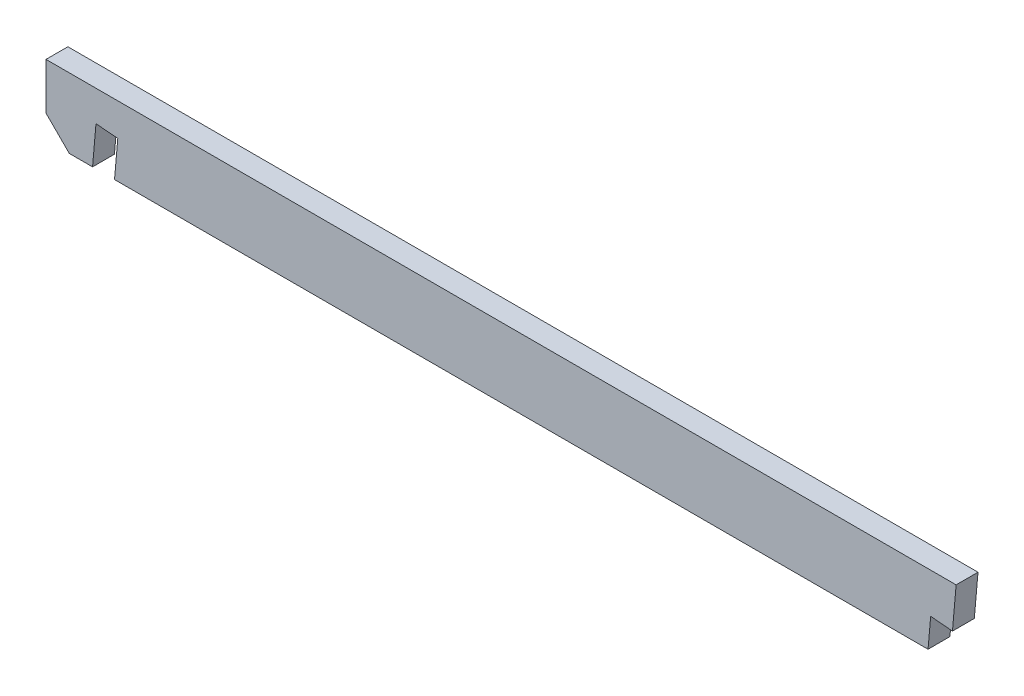
ISO-10303-21;
HEADER;
FILE_DESCRIPTION(('STEP AP214'),'2;1');
FILE_NAME('part.step','',(''),(''),'','','');
FILE_SCHEMA(('AUTOMOTIVE_DESIGN { 1 0 10303 214 1 1 1 1 }'));
ENDSEC;
DATA;
#1=APPLICATION_CONTEXT('core data for automotive mechanical design processes');
#2=APPLICATION_PROTOCOL_DEFINITION('international standard','automotive_design',2000,#1);
#3=PRODUCT_CONTEXT('',#1,'mechanical');
#4=PRODUCT('Part','Part','',(#3));
#5=PRODUCT_RELATED_PRODUCT_CATEGORY('part','',(#4));
#6=PRODUCT_DEFINITION_FORMATION('','',#4);
#7=PRODUCT_DEFINITION_CONTEXT('part definition',#1,'design');
#8=PRODUCT_DEFINITION('design','',#6,#7);
#9=PRODUCT_DEFINITION_SHAPE('','',#8);
#10=(LENGTH_UNIT() NAMED_UNIT(*) SI_UNIT(.MILLI.,.METRE.));
#11=(NAMED_UNIT(*) PLANE_ANGLE_UNIT() SI_UNIT($,.RADIAN.));
#12=(NAMED_UNIT(*) SI_UNIT($,.STERADIAN.) SOLID_ANGLE_UNIT());
#13=UNCERTAINTY_MEASURE_WITH_UNIT(LENGTH_MEASURE(1.E-05),#10,'distance_accuracy_value','');
#14=(GEOMETRIC_REPRESENTATION_CONTEXT(3) GLOBAL_UNCERTAINTY_ASSIGNED_CONTEXT((#13)) GLOBAL_UNIT_ASSIGNED_CONTEXT((#10,
#11,#12)) REPRESENTATION_CONTEXT('',''));
#15=CARTESIAN_POINT('',(0.,0.,0.));
#16=DIRECTION('',(0.,0.,1.));
#17=DIRECTION('',(1.,0.,0.));
#18=AXIS2_PLACEMENT_3D('',#15,#16,#17);
#19=CARTESIAN_POINT('',(1955.,-75.0000000000001,23.5));
#20=DIRECTION('',(0.,1.,0.));
#21=DIRECTION('',(0.,0.,1.));
#22=AXIS2_PLACEMENT_3D('',#19,#20,#21);
#23=PLANE('',#22);
#24=DIRECTION('',(-1.,0.,0.));
#25=VECTOR('',#24,1.);
#26=CARTESIAN_POINT('',(1955.,-75.0000000000001,23.5));
#27=LINE('',#26,#25);
#28=CARTESIAN_POINT('',(100.,-75.0000000000001,23.5));
#29=VERTEX_POINT('',#28);
#30=CARTESIAN_POINT('',(50.0000000000003,-75.0000000000001,23.5));
#31=VERTEX_POINT('',#30);
#32=EDGE_CURVE('E184',#29,#31,#27,.T.);
#33=ORIENTED_EDGE('',*,*,#32,.T.);
#34=DIRECTION('',(0.,0.,-1.));
#35=VECTOR('',#34,1.);
#36=CARTESIAN_POINT('',(50.0000000000003,-75.0000000000001,-23.5));
#37=LINE('',#36,#35);
#38=CARTESIAN_POINT('',(50.0000000000003,-75.0000000000001,-23.5));
#39=VERTEX_POINT('',#38);
#40=EDGE_CURVE('E193',#31,#39,#37,.T.);
#41=ORIENTED_EDGE('',*,*,#40,.T.);
#42=DIRECTION('',(-1.,0.,0.));
#43=VECTOR('',#42,1.);
#44=CARTESIAN_POINT('',(1955.,-75.0000000000001,-23.5));
#45=LINE('',#44,#43);
#46=CARTESIAN_POINT('',(100.,-75.0000000000001,-23.5));
#47=VERTEX_POINT('',#46);
#48=EDGE_CURVE('E176',#47,#39,#45,.T.);
#49=ORIENTED_EDGE('',*,*,#48,.F.);
#50=DIRECTION('',(0.,0.,1.));
#51=VECTOR('',#50,1.);
#52=CARTESIAN_POINT('',(100.,-75.0000000000001,-23.5));
#53=LINE('',#52,#51);
#54=EDGE_CURVE('E163',#47,#29,#53,.T.);
#55=ORIENTED_EDGE('',*,*,#54,.T.);
#56=EDGE_LOOP('',(#33,#41,#49,#55));
#57=FACE_BOUND('',#56,.T.);
#58=ADVANCED_FACE('F33',(#57),#23,.F.);
#59=CARTESIAN_POINT('',(1955.,-75.0000000000001,-23.5));
#60=DIRECTION('',(0.,0.,1.));
#61=DIRECTION('',(1.,0.,0.));
#62=AXIS2_PLACEMENT_3D('',#59,#60,#61);
#63=PLANE('',#62);
#64=DIRECTION('',(-0.996194698091746,0.087155742747652,0.));
#65=VECTOR('',#64,1.);
#66=CARTESIAN_POINT('',(1947.12602028267,-15.0000000000001,-23.5));
#67=LINE('',#66,#65);
#68=CARTESIAN_POINT('',(1947.12602028267,-15.0000000000009,-23.5));
#69=VERTEX_POINT('',#68);
#70=CARTESIAN_POINT('',(1900.30486947236,-10.9036800908604,-23.5));
#71=VERTEX_POINT('',#70);
#72=EDGE_CURVE('E48',#69,#71,#67,.T.);
#73=ORIENTED_EDGE('',*,*,#72,.T.);
#74=DIRECTION('',(-0.0871557427476514,-0.996194698091746,0.));
#75=VECTOR('',#74,1.);
#76=CARTESIAN_POINT('',(1900.30486947236,-10.9036800908604,-23.5));
#77=LINE('',#76,#75);
#78=CARTESIAN_POINT('',(1894.69716810658,-75.0000000000001,-23.5));
#79=VERTEX_POINT('',#78);
#80=EDGE_CURVE('E125',#71,#79,#77,.T.);
#81=ORIENTED_EDGE('',*,*,#80,.T.);
#82=CARTESIAN_POINT('',(147.179532364537,-75.0000000000001,-23.5));
#83=VERTEX_POINT('',#82);
#84=EDGE_CURVE('E182',#79,#83,#45,.T.);
#85=ORIENTED_EDGE('',*,*,#84,.T.);
#86=DIRECTION('',(0.0871557427476513,0.996194698091746,0.));
#87=VECTOR('',#86,1.);
#88=CARTESIAN_POINT('',(154.178625446611,4.99999999999994,-23.5));
#89=LINE('',#88,#87);
#90=CARTESIAN_POINT('',(154.178625446611,4.99999999999994,-23.5));
#91=VERTEX_POINT('',#90);
#92=EDGE_CURVE('E146',#83,#91,#89,.T.);
#93=ORIENTED_EDGE('',*,*,#92,.T.);
#94=DIRECTION('',(-0.996194698091746,0.0871557427476515,0.));
#95=VECTOR('',#94,1.);
#96=CARTESIAN_POINT('',(107.357474636299,9.09631990913956,-23.5));
#97=LINE('',#96,#95);
#98=CARTESIAN_POINT('',(107.357474636299,9.09631990913956,-23.5));
#99=VERTEX_POINT('',#98);
#100=EDGE_CURVE('E149',#91,#99,#97,.T.);
#101=ORIENTED_EDGE('',*,*,#100,.T.);
#102=DIRECTION('',(-0.087155742747651,-0.996194698091746,0.));
#103=VECTOR('',#102,1.);
#104=CARTESIAN_POINT('',(100.,-75.0000000000001,-23.5));
#105=LINE('',#104,#103);
#106=EDGE_CURVE('E153',#99,#47,#105,.T.);
#107=ORIENTED_EDGE('',*,*,#106,.T.);
#108=ORIENTED_EDGE('',*,*,#48,.T.);
#109=DIRECTION('',(-0.707106781186546,0.707106781186549,0.));
#110=VECTOR('',#109,1.);
#111=CARTESIAN_POINT('',(50.0000000000003,-75.0000000000001,-23.5));
#112=LINE('',#111,#110);
#113=CARTESIAN_POINT('',(0.,-24.9999999999996,-23.5));
#114=VERTEX_POINT('',#113);
#115=EDGE_CURVE('E196',#39,#114,#112,.T.);
#116=ORIENTED_EDGE('',*,*,#115,.T.);
#117=DIRECTION('',(0.,1.,0.));
#118=VECTOR('',#117,1.);
#119=CARTESIAN_POINT('',(0.,-75.0000000000001,-23.5));
#120=LINE('',#119,#118);
#121=CARTESIAN_POINT('',(0.,75.0000000000001,-23.5));
#122=VERTEX_POINT('',#121);
#123=EDGE_CURVE('E166',#114,#122,#120,.T.);
#124=ORIENTED_EDGE('',*,*,#123,.T.);
#125=DIRECTION('',(-1.,0.,0.));
#126=VECTOR('',#125,1.);
#127=CARTESIAN_POINT('',(1955.,75.0000000000001,-23.5));
#128=LINE('',#127,#126);
#129=CARTESIAN_POINT('',(1955.,75.0000000000001,-23.5));
#130=VERTEX_POINT('',#129);
#131=EDGE_CURVE('E190',#130,#122,#128,.T.);
#132=ORIENTED_EDGE('',*,*,#131,.F.);
#133=DIRECTION('',(0.0871557427476521,0.996194698091746,0.));
#134=VECTOR('',#133,1.);
#135=CARTESIAN_POINT('',(1955.,75.0000000000001,-23.5));
#136=LINE('',#135,#134);
#137=EDGE_CURVE('E134',#69,#130,#136,.T.);
#138=ORIENTED_EDGE('',*,*,#137,.F.);
#139=EDGE_LOOP('',(#73,#81,#85,#93,#101,#107,#108,#116,#124,#132,#138));
#140=FACE_BOUND('',#139,.T.);
#141=ADVANCED_FACE('F132',(#140),#63,.F.);
#142=CARTESIAN_POINT('',(1955.,75.0000000000001,23.5));
#143=DIRECTION('',(0.,-1.,0.));
#144=DIRECTION('',(0.,0.,-1.));
#145=AXIS2_PLACEMENT_3D('',#142,#143,#144);
#146=PLANE('',#145);
#147=DIRECTION('',(0.,0.,1.));
#148=VECTOR('',#147,1.);
#149=CARTESIAN_POINT('',(0.,75.0000000000001,23.5));
#150=LINE('',#149,#148);
#151=CARTESIAN_POINT('',(0.,75.0000000000001,23.5));
#152=VERTEX_POINT('',#151);
#153=EDGE_CURVE('E179',#122,#152,#150,.T.);
#154=ORIENTED_EDGE('',*,*,#153,.T.);
#155=DIRECTION('',(-1.,0.,0.));
#156=VECTOR('',#155,1.);
#157=CARTESIAN_POINT('',(1955.,75.0000000000001,23.5));
#158=LINE('',#157,#156);
#159=CARTESIAN_POINT('',(1955.,75.0000000000001,23.5));
#160=VERTEX_POINT('',#159);
#161=EDGE_CURVE('E187',#160,#152,#158,.T.);
#162=ORIENTED_EDGE('',*,*,#161,.F.);
#163=DIRECTION('',(0.,0.,1.));
#164=VECTOR('',#163,1.);
#165=CARTESIAN_POINT('',(1955.,75.0000000000001,23.5));
#166=LINE('',#165,#164);
#167=EDGE_CURVE('E173',#130,#160,#166,.T.);
#168=ORIENTED_EDGE('',*,*,#167,.F.);
#169=ORIENTED_EDGE('',*,*,#131,.T.);
#170=EDGE_LOOP('',(#154,#162,#168,#169));
#171=FACE_BOUND('',#170,.T.);
#172=ADVANCED_FACE('F232',(#171),#146,.F.);
#173=CARTESIAN_POINT('',(1955.,-75.0000000000001,23.5));
#174=DIRECTION('',(0.,0.,-1.));
#175=DIRECTION('',(-1.,0.,0.));
#176=AXIS2_PLACEMENT_3D('',#173,#174,#175);
#177=PLANE('',#176);
#178=CARTESIAN_POINT('',(1894.69716810658,-75.0000000000001,23.5));
#179=VERTEX_POINT('',#178);
#180=CARTESIAN_POINT('',(147.179532364537,-75.0000000000001,23.5));
#181=VERTEX_POINT('',#180);
#182=EDGE_CURVE('E185',#179,#181,#27,.T.);
#183=ORIENTED_EDGE('',*,*,#182,.F.);
#184=DIRECTION('',(-0.0871557427476514,-0.996194698091746,0.));
#185=VECTOR('',#184,1.);
#186=CARTESIAN_POINT('',(1900.30486947236,-10.9036800908604,23.5));
#187=LINE('',#186,#185);
#188=CARTESIAN_POINT('',(1900.30486947236,-10.9036800908604,23.5));
#189=VERTEX_POINT('',#188);
#190=EDGE_CURVE('E135',#189,#179,#187,.T.);
#191=ORIENTED_EDGE('',*,*,#190,.F.);
#192=DIRECTION('',(-0.996194698091746,0.087155742747652,0.));
#193=VECTOR('',#192,1.);
#194=CARTESIAN_POINT('',(1947.12602028267,-15.0000000000001,23.5));
#195=LINE('',#194,#193);
#196=CARTESIAN_POINT('',(1947.12602028267,-15.0000000000001,23.5));
#197=VERTEX_POINT('',#196);
#198=EDGE_CURVE('E118',#197,#189,#195,.T.);
#199=ORIENTED_EDGE('',*,*,#198,.F.);
#200=DIRECTION('',(0.0871557427476521,0.996194698091746,0.));
#201=VECTOR('',#200,1.);
#202=CARTESIAN_POINT('',(1955.,75.0000000000001,23.5));
#203=LINE('',#202,#201);
#204=EDGE_CURVE('E142',#197,#160,#203,.T.);
#205=ORIENTED_EDGE('',*,*,#204,.T.);
#206=ORIENTED_EDGE('',*,*,#161,.T.);
#207=DIRECTION('',(0.,-1.,0.));
#208=VECTOR('',#207,1.);
#209=CARTESIAN_POINT('',(0.,-75.0000000000001,23.5));
#210=LINE('',#209,#208);
#211=CARTESIAN_POINT('',(0.,-24.9999999999996,23.5));
#212=VERTEX_POINT('',#211);
#213=EDGE_CURVE('E177',#152,#212,#210,.T.);
#214=ORIENTED_EDGE('',*,*,#213,.T.);
#215=DIRECTION('',(0.707106781186546,-0.707106781186549,0.));
#216=VECTOR('',#215,1.);
#217=CARTESIAN_POINT('',(50.0000000000003,-75.0000000000001,23.5));
#218=LINE('',#217,#216);
#219=EDGE_CURVE('E11',#212,#31,#218,.T.);
#220=ORIENTED_EDGE('',*,*,#219,.T.);
#221=ORIENTED_EDGE('',*,*,#32,.F.);
#222=DIRECTION('',(-0.087155742747651,-0.996194698091746,0.));
#223=VECTOR('',#222,1.);
#224=CARTESIAN_POINT('',(100.,-75.0000000000001,23.5));
#225=LINE('',#224,#223);
#226=CARTESIAN_POINT('',(107.357474636299,9.09631990913956,23.5));
#227=VERTEX_POINT('',#226);
#228=EDGE_CURVE('E150',#227,#29,#225,.T.);
#229=ORIENTED_EDGE('',*,*,#228,.F.);
#230=DIRECTION('',(-0.996194698091746,0.0871557427476515,0.));
#231=VECTOR('',#230,1.);
#232=CARTESIAN_POINT('',(107.357474636299,9.09631990913956,23.5));
#233=LINE('',#232,#231);
#234=CARTESIAN_POINT('',(154.178625446611,4.99999999999994,23.5));
#235=VERTEX_POINT('',#234);
#236=EDGE_CURVE('E159',#235,#227,#233,.T.);
#237=ORIENTED_EDGE('',*,*,#236,.F.);
#238=DIRECTION('',(0.0871557427476513,0.996194698091746,0.));
#239=VECTOR('',#238,1.);
#240=CARTESIAN_POINT('',(154.178625446611,4.99999999999994,23.5));
#241=LINE('',#240,#239);
#242=EDGE_CURVE('E144',#181,#235,#241,.T.);
#243=ORIENTED_EDGE('',*,*,#242,.F.);
#244=EDGE_LOOP('',(#183,#191,#199,#205,#206,#214,#220,#221,#229,#237,#243));
#245=FACE_BOUND('',#244,.T.);
#246=ADVANCED_FACE('F208',(#245),#177,.F.);
#247=ORIENTED_EDGE('',*,*,#84,.F.);
#248=DIRECTION('',(0.,0.,1.));
#249=VECTOR('',#248,1.);
#250=CARTESIAN_POINT('',(1894.69716810658,-75.0000000000001,-23.5));
#251=LINE('',#250,#249);
#252=EDGE_CURVE('E121',#79,#179,#251,.T.);
#253=ORIENTED_EDGE('',*,*,#252,.T.);
#254=ORIENTED_EDGE('',*,*,#182,.T.);
#255=DIRECTION('',(0.,0.,1.));
#256=VECTOR('',#255,1.);
#257=CARTESIAN_POINT('',(147.179532364537,-75.0000000000001,-23.5));
#258=LINE('',#257,#256);
#259=EDGE_CURVE('E156',#83,#181,#258,.T.);
#260=ORIENTED_EDGE('',*,*,#259,.F.);
#261=EDGE_LOOP('',(#247,#253,#254,#260));
#262=FACE_BOUND('',#261,.T.);
#263=ADVANCED_FACE('F224',(#262),#23,.F.);
#264=CARTESIAN_POINT('',(0.,0.,0.));
#265=DIRECTION('',(-1.,0.,0.));
#266=DIRECTION('',(0.,0.,1.));
#267=AXIS2_PLACEMENT_3D('',#264,#265,#266);
#268=PLANE('',#267);
#269=ORIENTED_EDGE('',*,*,#123,.F.);
#270=DIRECTION('',(0.,0.,1.));
#271=VECTOR('',#270,1.);
#272=CARTESIAN_POINT('',(0.,-24.9999999999996,23.5));
#273=LINE('',#272,#271);
#274=EDGE_CURVE('E41',#114,#212,#273,.T.);
#275=ORIENTED_EDGE('',*,*,#274,.T.);
#276=ORIENTED_EDGE('',*,*,#213,.F.);
#277=ORIENTED_EDGE('',*,*,#153,.F.);
#278=EDGE_LOOP('',(#269,#275,#276,#277));
#279=FACE_BOUND('',#278,.T.);
#280=ADVANCED_FACE('F202',(#279),#268,.T.);
#281=CARTESIAN_POINT('',(100.,-75.0000000000001,-23.5));
#282=DIRECTION('',(-0.996194698091746,0.087155742747651,0.));
#283=DIRECTION('',(-0.087155742747651,-0.996194698091746,0.));
#284=AXIS2_PLACEMENT_3D('',#281,#282,#283);
#285=PLANE('',#284);
#286=ORIENTED_EDGE('',*,*,#228,.T.);
#287=ORIENTED_EDGE('',*,*,#54,.F.);
#288=ORIENTED_EDGE('',*,*,#106,.F.);
#289=DIRECTION('',(0.,0.,1.));
#290=VECTOR('',#289,1.);
#291=CARTESIAN_POINT('',(107.357474636299,9.09631990913956,-23.5));
#292=LINE('',#291,#290);
#293=EDGE_CURVE('E167',#99,#227,#292,.T.);
#294=ORIENTED_EDGE('',*,*,#293,.T.);
#295=EDGE_LOOP('',(#286,#287,#288,#294));
#296=FACE_BOUND('',#295,.T.);
#297=ADVANCED_FACE('F213',(#296),#285,.F.);
#298=CARTESIAN_POINT('',(107.357474636299,9.09631990913956,-23.5));
#299=DIRECTION('',(0.0871557427476515,0.996194698091746,0.));
#300=DIRECTION('',(-0.996194698091746,0.0871557427476515,0.));
#301=AXIS2_PLACEMENT_3D('',#298,#299,#300);
#302=PLANE('',#301);
#303=ORIENTED_EDGE('',*,*,#236,.T.);
#304=ORIENTED_EDGE('',*,*,#293,.F.);
#305=ORIENTED_EDGE('',*,*,#100,.F.);
#306=DIRECTION('',(0.,0.,1.));
#307=VECTOR('',#306,1.);
#308=CARTESIAN_POINT('',(154.178625446611,4.99999999999994,-23.5));
#309=LINE('',#308,#307);
#310=EDGE_CURVE('E169',#91,#235,#309,.T.);
#311=ORIENTED_EDGE('',*,*,#310,.T.);
#312=EDGE_LOOP('',(#303,#304,#305,#311));
#313=FACE_BOUND('',#312,.T.);
#314=ADVANCED_FACE('F217',(#313),#302,.F.);
#315=CARTESIAN_POINT('',(154.178625446611,4.99999999999994,-23.5));
#316=DIRECTION('',(0.996194698091746,-0.0871557427476512,0.));
#317=DIRECTION('',(0.0871557427476513,0.996194698091746,0.));
#318=AXIS2_PLACEMENT_3D('',#315,#316,#317);
#319=PLANE('',#318);
#320=ORIENTED_EDGE('',*,*,#242,.T.);
#321=ORIENTED_EDGE('',*,*,#310,.F.);
#322=ORIENTED_EDGE('',*,*,#92,.F.);
#323=ORIENTED_EDGE('',*,*,#259,.T.);
#324=EDGE_LOOP('',(#320,#321,#322,#323));
#325=FACE_BOUND('',#324,.T.);
#326=ADVANCED_FACE('F221',(#325),#319,.F.);
#327=CARTESIAN_POINT('',(50.0000000000003,-75.0000000000001,23.5));
#328=DIRECTION('',(-0.707106781186549,-0.707106781186546,0.));
#329=DIRECTION('',(0.,0.,1.));
#330=AXIS2_PLACEMENT_3D('',#327,#328,#329);
#331=PLANE('',#330);
#332=ORIENTED_EDGE('',*,*,#219,.F.);
#333=ORIENTED_EDGE('',*,*,#274,.F.);
#334=ORIENTED_EDGE('',*,*,#115,.F.);
#335=ORIENTED_EDGE('',*,*,#40,.F.);
#336=EDGE_LOOP('',(#332,#333,#334,#335));
#337=FACE_BOUND('',#336,.T.);
#338=ADVANCED_FACE('F35',(#337),#331,.T.);
#339=CARTESIAN_POINT('',(1955.,75.0000000000001,23.5));
#340=DIRECTION('',(-0.996194698091746,0.0871557427476521,0.));
#341=DIRECTION('',(-0.0871557427476521,-0.996194698091746,0.));
#342=AXIS2_PLACEMENT_3D('',#339,#340,#341);
#343=PLANE('',#342);
#344=ORIENTED_EDGE('',*,*,#204,.F.);
#345=DIRECTION('',(0.,0.,1.));
#346=VECTOR('',#345,1.);
#347=CARTESIAN_POINT('',(1947.12602028267,-15.0000000000001,-23.5));
#348=LINE('',#347,#346);
#349=EDGE_CURVE('E122',#69,#197,#348,.T.);
#350=ORIENTED_EDGE('',*,*,#349,.F.);
#351=ORIENTED_EDGE('',*,*,#137,.T.);
#352=ORIENTED_EDGE('',*,*,#167,.T.);
#353=EDGE_LOOP('',(#344,#350,#351,#352));
#354=FACE_BOUND('',#353,.T.);
#355=ADVANCED_FACE('F249',(#354),#343,.F.);
#356=CARTESIAN_POINT('',(1900.30486947236,-10.9036800908604,-23.5));
#357=DIRECTION('',(-0.996194698091746,0.0871557427476514,0.));
#358=DIRECTION('',(-0.0871557427476514,-0.996194698091746,0.));
#359=AXIS2_PLACEMENT_3D('',#356,#357,#358);
#360=PLANE('',#359);
#361=ORIENTED_EDGE('',*,*,#190,.T.);
#362=ORIENTED_EDGE('',*,*,#252,.F.);
#363=ORIENTED_EDGE('',*,*,#80,.F.);
#364=DIRECTION('',(0.,0.,1.));
#365=VECTOR('',#364,1.);
#366=CARTESIAN_POINT('',(1900.30486947236,-10.9036800908604,-23.5));
#367=LINE('',#366,#365);
#368=EDGE_CURVE('E114',#71,#189,#367,.T.);
#369=ORIENTED_EDGE('',*,*,#368,.T.);
#370=EDGE_LOOP('',(#361,#362,#363,#369));
#371=FACE_BOUND('',#370,.T.);
#372=ADVANCED_FACE('F126',(#371),#360,.F.);
#373=CARTESIAN_POINT('',(1947.12602028267,-15.0000000000001,-23.5));
#374=DIRECTION('',(0.087155742747652,0.996194698091746,0.));
#375=DIRECTION('',(-0.996194698091746,0.087155742747652,0.));
#376=AXIS2_PLACEMENT_3D('',#373,#374,#375);
#377=PLANE('',#376);
#378=ORIENTED_EDGE('',*,*,#198,.T.);
#379=ORIENTED_EDGE('',*,*,#368,.F.);
#380=ORIENTED_EDGE('',*,*,#72,.F.);
#381=ORIENTED_EDGE('',*,*,#349,.T.);
#382=EDGE_LOOP('',(#378,#379,#380,#381));
#383=FACE_BOUND('',#382,.T.);
#384=ADVANCED_FACE('F116',(#383),#377,.F.);
#385=CLOSED_SHELL('',(#58,#141,#172,#246,#263,#280,#297,#314,#326,#338,#355,#372,#384));
#386=MANIFOLD_SOLID_BREP('B2',#385);
#387=ADVANCED_BREP_SHAPE_REPRESENTATION('',(#18,#386),#14);
#388=SHAPE_DEFINITION_REPRESENTATION(#9,#387);
ENDSEC;
END-ISO-10303-21;
